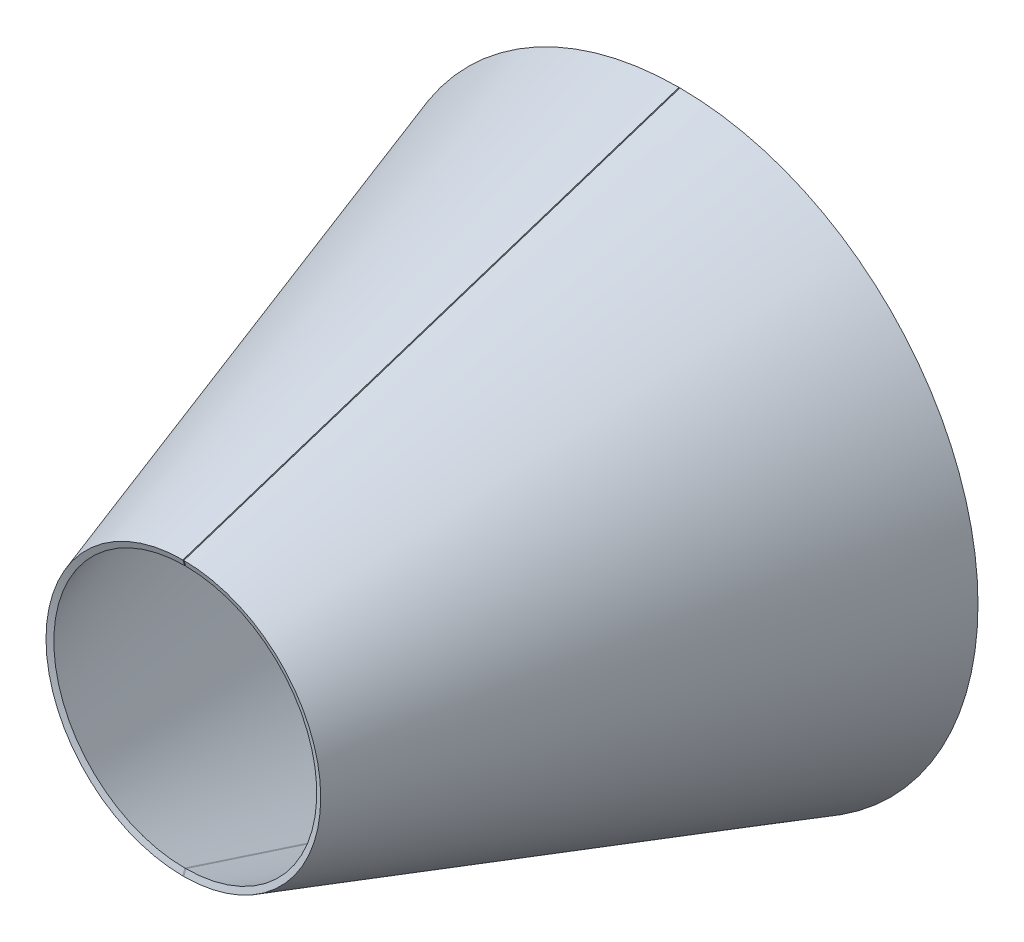
ISO-10303-21;
HEADER;
FILE_DESCRIPTION(('STEP AP214'),'2;1');
FILE_NAME('part.step','',(''),(''),'','','');
FILE_SCHEMA(('AUTOMOTIVE_DESIGN { 1 0 10303 214 1 1 1 1 }'));
ENDSEC;
DATA;
#1=APPLICATION_CONTEXT('core data for automotive mechanical design processes');
#2=APPLICATION_PROTOCOL_DEFINITION('international standard','automotive_design',2000,#1);
#3=PRODUCT_CONTEXT('',#1,'mechanical');
#4=PRODUCT('Part','Part','',(#3));
#5=PRODUCT_RELATED_PRODUCT_CATEGORY('part','',(#4));
#6=PRODUCT_DEFINITION_FORMATION('','',#4);
#7=PRODUCT_DEFINITION_CONTEXT('part definition',#1,'design');
#8=PRODUCT_DEFINITION('design','',#6,#7);
#9=PRODUCT_DEFINITION_SHAPE('','',#8);
#10=(LENGTH_UNIT() NAMED_UNIT(*) SI_UNIT(.MILLI.,.METRE.));
#11=(NAMED_UNIT(*) PLANE_ANGLE_UNIT() SI_UNIT($,.RADIAN.));
#12=(NAMED_UNIT(*) SI_UNIT($,.STERADIAN.) SOLID_ANGLE_UNIT());
#13=UNCERTAINTY_MEASURE_WITH_UNIT(LENGTH_MEASURE(1.E-05),#10,'distance_accuracy_value','');
#14=(GEOMETRIC_REPRESENTATION_CONTEXT(3) GLOBAL_UNCERTAINTY_ASSIGNED_CONTEXT((#13)) GLOBAL_UNIT_ASSIGNED_CONTEXT((#10,
#11,#12)) REPRESENTATION_CONTEXT('',''));
#15=CARTESIAN_POINT('',(0.,0.,0.));
#16=DIRECTION('',(0.,0.,1.));
#17=DIRECTION('',(1.,0.,0.));
#18=AXIS2_PLACEMENT_3D('',#15,#16,#17);
#19=CARTESIAN_POINT('',(0.254,-69.9851676002032,253.646772895918));
#20=DIRECTION('',(0.,0.951056516295156,-0.309016994374941));
#21=DIRECTION('',(0.,0.309016994374941,0.951056516295156));
#22=AXIS2_PLACEMENT_3D('',#19,#20,#21);
#23=PLANE('',#22);
#24=DIRECTION('',(0.,-0.309016994374941,-0.951056516295156));
#25=VECTOR('',#24,1.);
#26=CARTESIAN_POINT('',(-0.254,-69.9851676002032,253.646772895918));
#27=LINE('',#26,#25);
#28=CARTESIAN_POINT('',(-0.253999999999987,-69.9851676002029,253.646772895918));
#29=VERTEX_POINT('',#28);
#30=CARTESIAN_POINT('',(-0.254,-152.4,0.));
#31=VERTEX_POINT('',#30);
#32=EDGE_CURVE('E182',#29,#31,#27,.T.);
#33=ORIENTED_EDGE('',*,*,#32,.T.);
#34=DIRECTION('',(-1.,0.,0.));
#35=VECTOR('',#34,1.);
#36=CARTESIAN_POINT('',(0.254,-152.4,0.));
#37=LINE('',#36,#35);
#38=CARTESIAN_POINT('',(0.253999999999972,-152.4,-2.38524477946811E-13));
#39=VERTEX_POINT('',#38);
#40=EDGE_CURVE('E186',#39,#31,#37,.T.);
#41=ORIENTED_EDGE('',*,*,#40,.F.);
#42=DIRECTION('',(0.,-0.309016994374941,-0.951056516295156));
#43=VECTOR('',#42,1.);
#44=CARTESIAN_POINT('',(0.254,-69.9851676002032,253.646772895918));
#45=LINE('',#44,#43);
#46=CARTESIAN_POINT('',(0.254,-69.9851676002032,253.646772895918));
#47=VERTEX_POINT('',#46);
#48=EDGE_CURVE('E68',#47,#39,#45,.T.);
#49=ORIENTED_EDGE('',*,*,#48,.F.);
#50=DIRECTION('',(-1.,0.,0.));
#51=VECTOR('',#50,1.);
#52=CARTESIAN_POINT('',(0.254,-69.9851676002032,253.646772895918));
#53=LINE('',#52,#51);
#54=EDGE_CURVE('E191',#47,#29,#53,.T.);
#55=ORIENTED_EDGE('',*,*,#54,.T.);
#56=EDGE_LOOP('',(#33,#41,#49,#55));
#57=FACE_BOUND('',#56,.T.);
#58=ADVANCED_FACE('F43',(#57),#23,.F.);
#59=CARTESIAN_POINT('',(0.254,440.328902890436,87.8356801287253));
#60=DIRECTION('',(0.,0.309016994374941,0.951056516295156));
#61=DIRECTION('',(0.,-0.951056516295156,0.309016994374941));
#62=AXIS2_PLACEMENT_3D('',#59,#60,#61);
#63=PLANE('',#62);
#64=ORIENTED_EDGE('',*,*,#54,.F.);
#65=DIRECTION('',(0.,-0.951056516295156,0.309016994374941));
#66=VECTOR('',#65,1.);
#67=CARTESIAN_POINT('',(0.254,440.328902890436,87.8356801287253));
#68=LINE('',#67,#66);
#69=CARTESIAN_POINT('',(0.254,-66.965563160966,252.665643938778));
#70=VERTEX_POINT('',#69);
#71=EDGE_CURVE('E52',#70,#47,#68,.T.);
#72=ORIENTED_EDGE('',*,*,#71,.F.);
#73=DIRECTION('',(-1.,0.,0.));
#74=VECTOR('',#73,1.);
#75=CARTESIAN_POINT('',(0.254,-66.965563160966,252.665643938778));
#76=LINE('',#75,#74);
#77=CARTESIAN_POINT('',(-0.253999999999988,-66.9655631609659,252.665643938778));
#78=VERTEX_POINT('',#77);
#79=EDGE_CURVE('E198',#70,#78,#76,.T.);
#80=ORIENTED_EDGE('',*,*,#79,.T.);
#81=DIRECTION('',(0.,-0.951056516295156,0.309016994374941));
#82=VECTOR('',#81,1.);
#83=CARTESIAN_POINT('',(-0.254,440.328902890436,87.8356801287253));
#84=LINE('',#83,#82);
#85=EDGE_CURVE('E11',#78,#29,#84,.T.);
#86=ORIENTED_EDGE('',*,*,#85,.T.);
#87=EDGE_LOOP('',(#64,#72,#80,#86));
#88=FACE_BOUND('',#87,.T.);
#89=ADVANCED_FACE('F45',(#88),#63,.T.);
#90=CARTESIAN_POINT('',(0.254,357.914070490639,-165.811092767193));
#91=DIRECTION('',(0.,0.309016994374941,0.951056516295156));
#92=DIRECTION('',(0.,-0.951056516295156,0.309016994374941));
#93=AXIS2_PLACEMENT_3D('',#90,#91,#92);
#94=PLANE('',#93);
#95=DIRECTION('',(0.,-0.951056516295156,0.309016994374941));
#96=VECTOR('',#95,1.);
#97=CARTESIAN_POINT('',(0.254,357.914070490639,-165.811092767193));
#98=LINE('',#97,#96);
#99=CARTESIAN_POINT('',(0.254,-149.380395560763,-0.98112895714042));
#100=VERTEX_POINT('',#99);
#101=EDGE_CURVE('E209',#100,#39,#98,.T.);
#102=ORIENTED_EDGE('',*,*,#101,.T.);
#103=ORIENTED_EDGE('',*,*,#40,.T.);
#104=DIRECTION('',(0.,-0.951056516295156,0.309016994374941));
#105=VECTOR('',#104,1.);
#106=CARTESIAN_POINT('',(-0.254,357.914070490639,-165.811092767193));
#107=LINE('',#106,#105);
#108=CARTESIAN_POINT('',(-0.254000000000027,-149.380395560763,-0.981128957140655));
#109=VERTEX_POINT('',#108);
#110=EDGE_CURVE('E134',#109,#31,#107,.T.);
#111=ORIENTED_EDGE('',*,*,#110,.F.);
#112=DIRECTION('',(-1.,0.,0.));
#113=VECTOR('',#112,1.);
#114=CARTESIAN_POINT('',(0.254,-149.380395560763,-0.981128957140531));
#115=LINE('',#114,#113);
#116=EDGE_CURVE('E59',#100,#109,#115,.T.);
#117=ORIENTED_EDGE('',*,*,#116,.F.);
#118=EDGE_LOOP('',(#102,#103,#111,#117));
#119=FACE_BOUND('',#118,.T.);
#120=ADVANCED_FACE('F236',(#119),#94,.F.);
#121=CARTESIAN_POINT('',(0.254,-66.965563160966,252.665643938778));
#122=DIRECTION('',(0.,0.951056516295156,-0.309016994374941));
#123=DIRECTION('',(0.,0.309016994374941,0.951056516295156));
#124=AXIS2_PLACEMENT_3D('',#121,#122,#123);
#125=PLANE('',#124);
#126=DIRECTION('',(0.,-0.309016994374941,-0.951056516295156));
#127=VECTOR('',#126,1.);
#128=CARTESIAN_POINT('',(-0.254,-66.965563160966,252.665643938778));
#129=LINE('',#128,#127);
#130=EDGE_CURVE('E194',#78,#109,#129,.T.);
#131=ORIENTED_EDGE('',*,*,#130,.F.);
#132=ORIENTED_EDGE('',*,*,#79,.F.);
#133=DIRECTION('',(0.,-0.309016994374941,-0.951056516295156));
#134=VECTOR('',#133,1.);
#135=CARTESIAN_POINT('',(0.254,-66.965563160966,252.665643938778));
#136=LINE('',#135,#134);
#137=EDGE_CURVE('E202',#70,#100,#136,.T.);
#138=ORIENTED_EDGE('',*,*,#137,.T.);
#139=ORIENTED_EDGE('',*,*,#116,.T.);
#140=EDGE_LOOP('',(#131,#132,#138,#139));
#141=FACE_BOUND('',#140,.T.);
#142=ADVANCED_FACE('F233',(#141),#125,.T.);
#143=CARTESIAN_POINT('',(0.253999999996619,150.709021514027,-0.549432215998735));
#144=DIRECTION('',(-1.,0.,0.));
#145=DIRECTION('',(0.,-0.309016994374941,0.951056516295156));
#146=AXIS2_PLACEMENT_3D('',#143,#144,#145);
#147=PLANE('',#146);
#148=DIRECTION('',(0.,-0.951056516295156,-0.309016994374941));
#149=VECTOR('',#148,1.);
#150=CARTESIAN_POINT('',(0.253999999998586,68.2941891142304,253.097340679919));
#151=LINE('',#150,#149);
#152=CARTESIAN_POINT('',(0.25399999999855,69.9851676002032,253.646772895918));
#153=VERTEX_POINT('',#152);
#154=CARTESIAN_POINT('',(0.253999999998613,66.9655631609661,252.665643938777));
#155=VERTEX_POINT('',#154);
#156=EDGE_CURVE('E179',#153,#155,#151,.T.);
#157=ORIENTED_EDGE('',*,*,#156,.F.);
#158=DIRECTION('',(0.,0.309016994374941,-0.951056516295156));
#159=VECTOR('',#158,1.);
#160=CARTESIAN_POINT('',(0.253999999981772,835.341891142304,-2101.87901521605));
#161=LINE('',#160,#159);
#162=CARTESIAN_POINT('',(0.253999999996581,152.4,0.));
#163=VERTEX_POINT('',#162);
#164=EDGE_CURVE('E170',#163,#153,#161,.F.);
#165=ORIENTED_EDGE('',*,*,#164,.F.);
#166=DIRECTION('',(0.,-0.951056516295156,-0.309016994374941));
#167=VECTOR('',#166,1.);
#168=CARTESIAN_POINT('',(0.253999999996619,150.709021514027,-0.549432215998735));
#169=LINE('',#168,#167);
#170=CARTESIAN_POINT('',(0.253999999996649,149.380395560763,-0.981128957140523));
#171=VERTEX_POINT('',#170);
#172=EDGE_CURVE('E157',#163,#171,#169,.T.);
#173=ORIENTED_EDGE('',*,*,#172,.T.);
#174=DIRECTION('',(0.,0.309016994374941,-0.951056516295156));
#175=VECTOR('',#174,1.);
#176=CARTESIAN_POINT('',(0.253999999981837,832.322286703067,-2102.86014417319));
#177=LINE('',#176,#175);
#178=EDGE_CURVE('E158',#171,#155,#177,.F.);
#179=ORIENTED_EDGE('',*,*,#178,.T.);
#180=EDGE_LOOP('',(#157,#165,#173,#179));
#181=FACE_BOUND('',#180,.T.);
#182=ADVANCED_FACE('F225',(#181),#147,.T.);
#183=CARTESIAN_POINT('',(0.254,0.,-0.549432215998902));
#184=DIRECTION('',(0.,0.,1.));
#185=DIRECTION('',(1.,0.,0.));
#186=AXIS2_PLACEMENT_3D('',#183,#184,#185);
#187=CONICAL_SURFACE('',#186,150.709021514027,1.25663706143592);
#188=ORIENTED_EDGE('',*,*,#172,.F.);
#189=CARTESIAN_POINT('',(0.254,0.,-4.44089209850063E-13));
#190=DIRECTION('',(0.,0.,-1.));
#191=DIRECTION('',(-1.,0.,0.));
#192=AXIS2_PLACEMENT_3D('',#189,#190,#191);
#193=CIRCLE('',#192,152.4);
#194=EDGE_CURVE('E166',#39,#163,#193,.F.);
#195=ORIENTED_EDGE('',*,*,#194,.F.);
#196=ORIENTED_EDGE('',*,*,#101,.F.);
#197=CARTESIAN_POINT('',(0.254,0.,-0.981128957140864));
#198=DIRECTION('',(0.,0.,-1.));
#199=DIRECTION('',(-1.,0.,0.));
#200=AXIS2_PLACEMENT_3D('',#197,#198,#199);
#201=CIRCLE('',#200,149.380395560763);
#202=EDGE_CURVE('E153',#100,#171,#201,.F.);
#203=ORIENTED_EDGE('',*,*,#202,.T.);
#204=EDGE_LOOP('',(#188,#195,#196,#203));
#205=FACE_BOUND('',#204,.T.);
#206=ADVANCED_FACE('F235',(#205),#187,.T.);
#207=CARTESIAN_POINT('',(0.254,0.,253.097340679919));
#208=DIRECTION('',(0.,0.,1.));
#209=DIRECTION('',(1.,0.,0.));
#210=AXIS2_PLACEMENT_3D('',#207,#208,#209);
#211=CONICAL_SURFACE('',#210,68.2941891142304,1.25663706143592);
#212=CARTESIAN_POINT('',(0.254,0.,253.646772895918));
#213=DIRECTION('',(0.,0.,-1.));
#214=DIRECTION('',(-1.,0.,0.));
#215=AXIS2_PLACEMENT_3D('',#212,#213,#214);
#216=CIRCLE('',#215,69.9851676002032);
#217=EDGE_CURVE('E152',#153,#47,#216,.T.);
#218=ORIENTED_EDGE('',*,*,#217,.F.);
#219=ORIENTED_EDGE('',*,*,#156,.T.);
#220=CARTESIAN_POINT('',(0.254,0.,252.665643938777));
#221=DIRECTION('',(0.,0.,-1.));
#222=DIRECTION('',(-1.,0.,0.));
#223=AXIS2_PLACEMENT_3D('',#220,#221,#222);
#224=CIRCLE('',#223,66.9655631609661);
#225=EDGE_CURVE('E162',#155,#70,#224,.T.);
#226=ORIENTED_EDGE('',*,*,#225,.T.);
#227=ORIENTED_EDGE('',*,*,#71,.T.);
#228=EDGE_LOOP('',(#218,#219,#226,#227));
#229=FACE_BOUND('',#228,.T.);
#230=ADVANCED_FACE('F215',(#229),#211,.F.);
#231=CARTESIAN_POINT('',(0.254,0.,-2102.86014417319));
#232=DIRECTION('',(0.,0.,-1.));
#233=DIRECTION('',(-1.,0.,0.));
#234=AXIS2_PLACEMENT_3D('',#231,#232,#233);
#235=CONICAL_SURFACE('',#234,832.322286703067,0.314159265358973);
#236=ORIENTED_EDGE('',*,*,#137,.F.);
#237=ORIENTED_EDGE('',*,*,#225,.F.);
#238=ORIENTED_EDGE('',*,*,#178,.F.);
#239=ORIENTED_EDGE('',*,*,#202,.F.);
#240=EDGE_LOOP('',(#236,#237,#238,#239));
#241=FACE_BOUND('',#240,.T.);
#242=ADVANCED_FACE('F228',(#241),#235,.F.);
#243=CARTESIAN_POINT('',(0.254,0.,-2101.87901521605));
#244=DIRECTION('',(0.,0.,-1.));
#245=DIRECTION('',(-1.,0.,0.));
#246=AXIS2_PLACEMENT_3D('',#243,#244,#245);
#247=CONICAL_SURFACE('',#246,835.341891142304,0.314159265358973);
#248=ORIENTED_EDGE('',*,*,#48,.T.);
#249=ORIENTED_EDGE('',*,*,#194,.T.);
#250=ORIENTED_EDGE('',*,*,#164,.T.);
#251=ORIENTED_EDGE('',*,*,#217,.T.);
#252=EDGE_LOOP('',(#248,#249,#250,#251));
#253=FACE_BOUND('',#252,.T.);
#254=ADVANCED_FACE('F221',(#253),#247,.T.);
#255=CARTESIAN_POINT('',(-0.253999999998418,68.2941891142303,253.097340679919));
#256=DIRECTION('',(1.,0.,0.));
#257=DIRECTION('',(0.,0.309016994374941,-0.951056516295156));
#258=AXIS2_PLACEMENT_3D('',#255,#256,#257);
#259=PLANE('',#258);
#260=DIRECTION('',(0.,0.951056516295156,0.309016994374941));
#261=VECTOR('',#260,1.);
#262=CARTESIAN_POINT('',(-0.253999999998418,68.2941891142303,253.097340679919));
#263=LINE('',#262,#261);
#264=CARTESIAN_POINT('',(-0.253999999998449,66.9655631609661,252.665643938778));
#265=VERTEX_POINT('',#264);
#266=CARTESIAN_POINT('',(-0.253999999998379,69.985167600203,253.646772895918));
#267=VERTEX_POINT('',#266);
#268=EDGE_CURVE('E122',#265,#267,#263,.T.);
#269=ORIENTED_EDGE('',*,*,#268,.F.);
#270=DIRECTION('',(0.,0.309016994374941,-0.951056516295156));
#271=VECTOR('',#270,1.);
#272=CARTESIAN_POINT('',(-0.25399999998157,832.322286703067,-2102.86014417319));
#273=LINE('',#272,#271);
#274=CARTESIAN_POINT('',(-0.25399999999674,149.380395560763,-0.981128957140655));
#275=VERTEX_POINT('',#274);
#276=EDGE_CURVE('E117',#265,#275,#273,.T.);
#277=ORIENTED_EDGE('',*,*,#276,.T.);
#278=DIRECTION('',(0.,0.951056516295156,0.309016994374941));
#279=VECTOR('',#278,1.);
#280=CARTESIAN_POINT('',(-0.253999999996711,150.709021514027,-0.549432215998902));
#281=LINE('',#280,#279);
#282=CARTESIAN_POINT('',(-0.253999999996674,152.4,-2.72893686814601E-13));
#283=VERTEX_POINT('',#282);
#284=EDGE_CURVE('E112',#275,#283,#281,.T.);
#285=ORIENTED_EDGE('',*,*,#284,.T.);
#286=DIRECTION('',(0.,0.309016994374941,-0.951056516295156));
#287=VECTOR('',#286,1.);
#288=CARTESIAN_POINT('',(-0.253999999981503,835.341891142304,-2101.87901521605));
#289=LINE('',#288,#287);
#290=EDGE_CURVE('E115',#267,#283,#289,.T.);
#291=ORIENTED_EDGE('',*,*,#290,.F.);
#292=EDGE_LOOP('',(#269,#277,#285,#291));
#293=FACE_BOUND('',#292,.T.);
#294=ADVANCED_FACE('F114',(#293),#259,.T.);
#295=CARTESIAN_POINT('',(-0.254,0.,-0.549432215998902));
#296=DIRECTION('',(0.,0.,1.));
#297=DIRECTION('',(1.,0.,0.));
#298=AXIS2_PLACEMENT_3D('',#295,#296,#297);
#299=CONICAL_SURFACE('',#298,150.709021514027,1.25663706143592);
#300=ORIENTED_EDGE('',*,*,#284,.F.);
#301=CARTESIAN_POINT('',(-0.254,0.,-0.981128957140864));
#302=DIRECTION('',(0.,0.,-1.));
#303=DIRECTION('',(-1.,0.,0.));
#304=AXIS2_PLACEMENT_3D('',#301,#302,#303);
#305=CIRCLE('',#304,149.380395560763);
#306=EDGE_CURVE('E145',#275,#109,#305,.F.);
#307=ORIENTED_EDGE('',*,*,#306,.T.);
#308=ORIENTED_EDGE('',*,*,#110,.T.);
#309=CARTESIAN_POINT('',(-0.254,0.,-4.44089209850063E-13));
#310=DIRECTION('',(0.,0.,-1.));
#311=DIRECTION('',(-1.,0.,0.));
#312=AXIS2_PLACEMENT_3D('',#309,#310,#311);
#313=CIRCLE('',#312,152.4);
#314=EDGE_CURVE('E129',#283,#31,#313,.F.);
#315=ORIENTED_EDGE('',*,*,#314,.F.);
#316=EDGE_LOOP('',(#300,#307,#308,#315));
#317=FACE_BOUND('',#316,.T.);
#318=ADVANCED_FACE('F133',(#317),#299,.T.);
#319=CARTESIAN_POINT('',(-0.254,0.,253.09734067992));
#320=DIRECTION('',(0.,0.,1.));
#321=DIRECTION('',(1.,0.,0.));
#322=AXIS2_PLACEMENT_3D('',#319,#320,#321);
#323=CONICAL_SURFACE('',#322,68.2941891142303,1.25663706143592);
#324=CARTESIAN_POINT('',(-0.254,0.,252.665643938778));
#325=DIRECTION('',(0.,0.,-1.));
#326=DIRECTION('',(-1.,0.,0.));
#327=AXIS2_PLACEMENT_3D('',#324,#325,#326);
#328=CIRCLE('',#327,66.9655631609659);
#329=EDGE_CURVE('E137',#78,#265,#328,.T.);
#330=ORIENTED_EDGE('',*,*,#329,.T.);
#331=ORIENTED_EDGE('',*,*,#268,.T.);
#332=CARTESIAN_POINT('',(-0.254,0.,253.646772895918));
#333=DIRECTION('',(0.,0.,-1.));
#334=DIRECTION('',(-1.,0.,0.));
#335=AXIS2_PLACEMENT_3D('',#332,#333,#334);
#336=CIRCLE('',#335,69.985167600203);
#337=EDGE_CURVE('E123',#29,#267,#336,.T.);
#338=ORIENTED_EDGE('',*,*,#337,.F.);
#339=ORIENTED_EDGE('',*,*,#85,.F.);
#340=EDGE_LOOP('',(#330,#331,#338,#339));
#341=FACE_BOUND('',#340,.T.);
#342=ADVANCED_FACE('F239',(#341),#323,.F.);
#343=CARTESIAN_POINT('',(-0.254,0.,-2101.87901521605));
#344=DIRECTION('',(0.,0.,-1.));
#345=DIRECTION('',(-1.,0.,0.));
#346=AXIS2_PLACEMENT_3D('',#343,#344,#345);
#347=CONICAL_SURFACE('',#346,835.341891142304,0.314159265358973);
#348=ORIENTED_EDGE('',*,*,#32,.F.);
#349=ORIENTED_EDGE('',*,*,#337,.T.);
#350=ORIENTED_EDGE('',*,*,#290,.T.);
#351=ORIENTED_EDGE('',*,*,#314,.T.);
#352=EDGE_LOOP('',(#348,#349,#350,#351));
#353=FACE_BOUND('',#352,.T.);
#354=ADVANCED_FACE('F128',(#353),#347,.T.);
#355=CARTESIAN_POINT('',(-0.254,0.,-2102.86014417319));
#356=DIRECTION('',(0.,0.,-1.));
#357=DIRECTION('',(-1.,0.,0.));
#358=AXIS2_PLACEMENT_3D('',#355,#356,#357);
#359=CONICAL_SURFACE('',#358,832.322286703067,0.314159265358973);
#360=ORIENTED_EDGE('',*,*,#130,.T.);
#361=ORIENTED_EDGE('',*,*,#306,.F.);
#362=ORIENTED_EDGE('',*,*,#276,.F.);
#363=ORIENTED_EDGE('',*,*,#329,.F.);
#364=EDGE_LOOP('',(#360,#361,#362,#363));
#365=FACE_BOUND('',#364,.T.);
#366=ADVANCED_FACE('F241',(#365),#359,.F.);
#367=CLOSED_SHELL('',(#58,#89,#120,#142,#182,#206,#230,#242,#254,#294,#318,#342,#354,#366));
#368=MANIFOLD_SOLID_BREP('B2',#367);
#369=ADVANCED_BREP_SHAPE_REPRESENTATION('',(#18,#368),#14);
#370=SHAPE_DEFINITION_REPRESENTATION(#9,#369);
ENDSEC;
END-ISO-10303-21;
